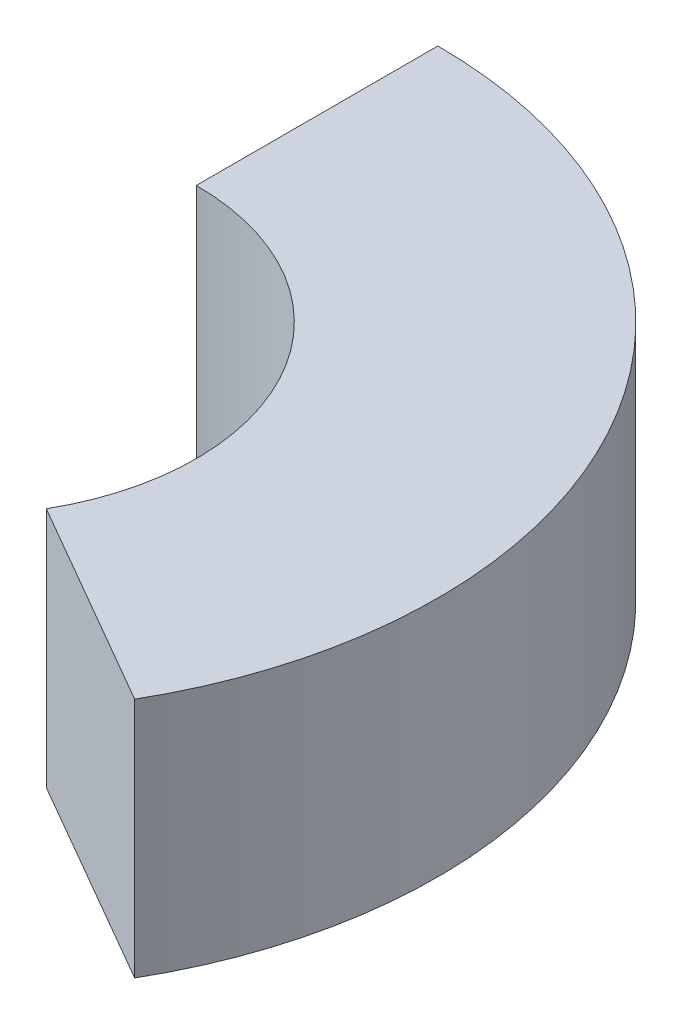
ISO-10303-21;
HEADER;
FILE_DESCRIPTION(('STEP AP214'),'2;1');
FILE_NAME('part.step','',(''),(''),'','','');
FILE_SCHEMA(('AUTOMOTIVE_DESIGN { 1 0 10303 214 1 1 1 1 }'));
ENDSEC;
DATA;
#1=APPLICATION_CONTEXT('core data for automotive mechanical design processes');
#2=APPLICATION_PROTOCOL_DEFINITION('international standard','automotive_design',2000,#1);
#3=PRODUCT_CONTEXT('',#1,'mechanical');
#4=PRODUCT('Part','Part','',(#3));
#5=PRODUCT_RELATED_PRODUCT_CATEGORY('part','',(#4));
#6=PRODUCT_DEFINITION_FORMATION('','',#4);
#7=PRODUCT_DEFINITION_CONTEXT('part definition',#1,'design');
#8=PRODUCT_DEFINITION('design','',#6,#7);
#9=PRODUCT_DEFINITION_SHAPE('','',#8);
#10=(LENGTH_UNIT() NAMED_UNIT(*) SI_UNIT(.MILLI.,.METRE.));
#11=(NAMED_UNIT(*) PLANE_ANGLE_UNIT() SI_UNIT($,.RADIAN.));
#12=(NAMED_UNIT(*) SI_UNIT($,.STERADIAN.) SOLID_ANGLE_UNIT());
#13=UNCERTAINTY_MEASURE_WITH_UNIT(LENGTH_MEASURE(1.E-05),#10,'distance_accuracy_value','');
#14=(GEOMETRIC_REPRESENTATION_CONTEXT(3) GLOBAL_UNCERTAINTY_ASSIGNED_CONTEXT((#13)) GLOBAL_UNIT_ASSIGNED_CONTEXT((#10,
#11,#12)) REPRESENTATION_CONTEXT('',''));
#15=CARTESIAN_POINT('',(0.,0.,0.));
#16=DIRECTION('',(0.,0.,1.));
#17=DIRECTION('',(1.,0.,0.));
#18=AXIS2_PLACEMENT_3D('',#15,#16,#17);
#19=CARTESIAN_POINT('',(0.,150.,0.));
#20=DIRECTION('',(0.,-1.,0.));
#21=DIRECTION('',(0.,0.,-1.));
#22=AXIS2_PLACEMENT_3D('',#19,#20,#21);
#23=CYLINDRICAL_SURFACE('',#22,297.);
#24=CARTESIAN_POINT('',(0.,0.,0.));
#25=DIRECTION('',(0.,1.,0.));
#26=DIRECTION('',(0.,0.,1.));
#27=AXIS2_PLACEMENT_3D('',#24,#25,#26);
#28=CIRCLE('',#27,297.);
#29=CARTESIAN_POINT('',(0.,0.,-297.));
#30=VERTEX_POINT('',#29);
#31=CARTESIAN_POINT('',(257.209544923977,0.,148.500000000001));
#32=VERTEX_POINT('',#31);
#33=EDGE_CURVE('E110',#30,#32,#28,.F.);
#34=ORIENTED_EDGE('',*,*,#33,.F.);
#35=DIRECTION('',(0.,-1.,0.));
#36=VECTOR('',#35,1.);
#37=CARTESIAN_POINT('',(0.,150.,-297.));
#38=LINE('',#37,#36);
#39=CARTESIAN_POINT('',(0.,150.,-297.));
#40=VERTEX_POINT('',#39);
#41=EDGE_CURVE('E11',#40,#30,#38,.T.);
#42=ORIENTED_EDGE('',*,*,#41,.F.);
#43=CARTESIAN_POINT('',(0.,150.,0.));
#44=DIRECTION('',(0.,1.,0.));
#45=DIRECTION('',(0.,0.,1.));
#46=AXIS2_PLACEMENT_3D('',#43,#44,#45);
#47=CIRCLE('',#46,297.);
#48=CARTESIAN_POINT('',(257.209544923977,150.,148.500000000001));
#49=VERTEX_POINT('',#48);
#50=EDGE_CURVE('E101',#40,#49,#47,.F.);
#51=ORIENTED_EDGE('',*,*,#50,.T.);
#52=DIRECTION('',(0.,-1.,0.));
#53=VECTOR('',#52,1.);
#54=CARTESIAN_POINT('',(257.209544923977,150.,148.500000000001));
#55=LINE('',#54,#53);
#56=EDGE_CURVE('E80',#49,#32,#55,.T.);
#57=ORIENTED_EDGE('',*,*,#56,.T.);
#58=EDGE_LOOP('',(#34,#42,#51,#57));
#59=FACE_BOUND('',#58,.T.);
#60=ADVANCED_FACE('F41',(#59),#23,.T.);
#61=CARTESIAN_POINT('',(0.,150.,0.));
#62=DIRECTION('',(-1.,0.,0.));
#63=DIRECTION('',(0.,0.,1.));
#64=AXIS2_PLACEMENT_3D('',#61,#62,#63);
#65=PLANE('',#64);
#66=DIRECTION('',(0.,0.,-1.));
#67=VECTOR('',#66,1.);
#68=CARTESIAN_POINT('',(0.,0.,0.));
#69=LINE('',#68,#67);
#70=CARTESIAN_POINT('',(0.,0.,-147.));
#71=VERTEX_POINT('',#70);
#72=EDGE_CURVE('E93',#71,#30,#69,.T.);
#73=ORIENTED_EDGE('',*,*,#72,.F.);
#74=DIRECTION('',(0.,-1.,0.));
#75=VECTOR('',#74,1.);
#76=CARTESIAN_POINT('',(0.,150.,-147.));
#77=LINE('',#76,#75);
#78=CARTESIAN_POINT('',(0.,150.,-147.));
#79=VERTEX_POINT('',#78);
#80=EDGE_CURVE('E50',#79,#71,#77,.T.);
#81=ORIENTED_EDGE('',*,*,#80,.F.);
#82=DIRECTION('',(0.,0.,-1.));
#83=VECTOR('',#82,1.);
#84=CARTESIAN_POINT('',(0.,150.,0.));
#85=LINE('',#84,#83);
#86=EDGE_CURVE('E91',#79,#40,#85,.T.);
#87=ORIENTED_EDGE('',*,*,#86,.T.);
#88=ORIENTED_EDGE('',*,*,#41,.T.);
#89=EDGE_LOOP('',(#73,#81,#87,#88));
#90=FACE_BOUND('',#89,.T.);
#91=ADVANCED_FACE('F89',(#90),#65,.T.);
#92=CARTESIAN_POINT('',(0.,150.,0.));
#93=DIRECTION('',(0.,-1.,0.));
#94=DIRECTION('',(0.,0.,-1.));
#95=AXIS2_PLACEMENT_3D('',#92,#93,#94);
#96=CYLINDRICAL_SURFACE('',#95,147.);
#97=CARTESIAN_POINT('',(0.,0.,0.));
#98=DIRECTION('',(0.,1.,0.));
#99=DIRECTION('',(0.,0.,1.));
#100=AXIS2_PLACEMENT_3D('',#97,#98,#99);
#101=CIRCLE('',#100,147.);
#102=CARTESIAN_POINT('',(127.305734356312,0.,73.5000000000007));
#103=VERTEX_POINT('',#102);
#104=EDGE_CURVE('E73',#71,#103,#101,.F.);
#105=ORIENTED_EDGE('',*,*,#104,.T.);
#106=DIRECTION('',(0.,-1.,0.));
#107=VECTOR('',#106,1.);
#108=CARTESIAN_POINT('',(127.305734356312,150.,73.5000000000007));
#109=LINE('',#108,#107);
#110=CARTESIAN_POINT('',(127.305734356312,150.,73.5000000000007));
#111=VERTEX_POINT('',#110);
#112=EDGE_CURVE('E95',#111,#103,#109,.T.);
#113=ORIENTED_EDGE('',*,*,#112,.F.);
#114=CARTESIAN_POINT('',(0.,150.,0.));
#115=DIRECTION('',(0.,1.,0.));
#116=DIRECTION('',(0.,0.,1.));
#117=AXIS2_PLACEMENT_3D('',#114,#115,#116);
#118=CIRCLE('',#117,147.);
#119=EDGE_CURVE('E96',#79,#111,#118,.F.);
#120=ORIENTED_EDGE('',*,*,#119,.F.);
#121=ORIENTED_EDGE('',*,*,#80,.T.);
#122=EDGE_LOOP('',(#105,#113,#120,#121));
#123=FACE_BOUND('',#122,.T.);
#124=ADVANCED_FACE('F97',(#123),#96,.F.);
#125=CARTESIAN_POINT('',(0.,150.,0.));
#126=DIRECTION('',(0.500000000000004,0.,-0.866025403784436));
#127=DIRECTION('',(-0.866025403784436,0.,-0.500000000000004));
#128=AXIS2_PLACEMENT_3D('',#125,#126,#127);
#129=PLANE('',#128);
#130=DIRECTION('',(0.866025403784436,0.,0.500000000000004));
#131=VECTOR('',#130,1.);
#132=CARTESIAN_POINT('',(0.,0.,0.));
#133=LINE('',#132,#131);
#134=EDGE_CURVE('E105',#103,#32,#133,.T.);
#135=ORIENTED_EDGE('',*,*,#134,.T.);
#136=ORIENTED_EDGE('',*,*,#56,.F.);
#137=DIRECTION('',(0.866025403784436,0.,0.500000000000004));
#138=VECTOR('',#137,1.);
#139=CARTESIAN_POINT('',(0.,150.,0.));
#140=LINE('',#139,#138);
#141=EDGE_CURVE('E58',#111,#49,#140,.T.);
#142=ORIENTED_EDGE('',*,*,#141,.F.);
#143=ORIENTED_EDGE('',*,*,#112,.T.);
#144=EDGE_LOOP('',(#135,#136,#142,#143));
#145=FACE_BOUND('',#144,.T.);
#146=ADVANCED_FACE('F125',(#145),#129,.F.);
#147=CARTESIAN_POINT('',(0.,150.,0.));
#148=DIRECTION('',(0.,1.,0.));
#149=DIRECTION('',(0.,0.,1.));
#150=AXIS2_PLACEMENT_3D('',#147,#148,#149);
#151=PLANE('',#150);
#152=ORIENTED_EDGE('',*,*,#50,.F.);
#153=ORIENTED_EDGE('',*,*,#86,.F.);
#154=ORIENTED_EDGE('',*,*,#119,.T.);
#155=ORIENTED_EDGE('',*,*,#141,.T.);
#156=EDGE_LOOP('',(#152,#153,#154,#155));
#157=FACE_BOUND('',#156,.T.);
#158=ADVANCED_FACE('F100',(#157),#151,.T.);
#159=CARTESIAN_POINT('',(0.,0.,0.));
#160=DIRECTION('',(0.,1.,0.));
#161=DIRECTION('',(0.,0.,1.));
#162=AXIS2_PLACEMENT_3D('',#159,#160,#161);
#163=PLANE('',#162);
#164=ORIENTED_EDGE('',*,*,#33,.T.);
#165=ORIENTED_EDGE('',*,*,#134,.F.);
#166=ORIENTED_EDGE('',*,*,#104,.F.);
#167=ORIENTED_EDGE('',*,*,#72,.T.);
#168=EDGE_LOOP('',(#164,#165,#166,#167));
#169=FACE_BOUND('',#168,.T.);
#170=ADVANCED_FACE('F127',(#169),#163,.F.);
#171=CLOSED_SHELL('',(#60,#91,#124,#146,#158,#170));
#172=MANIFOLD_SOLID_BREP('B2',#171);
#173=ADVANCED_BREP_SHAPE_REPRESENTATION('',(#18,#172),#14);
#174=SHAPE_DEFINITION_REPRESENTATION(#9,#173);
ENDSEC;
END-ISO-10303-21;
